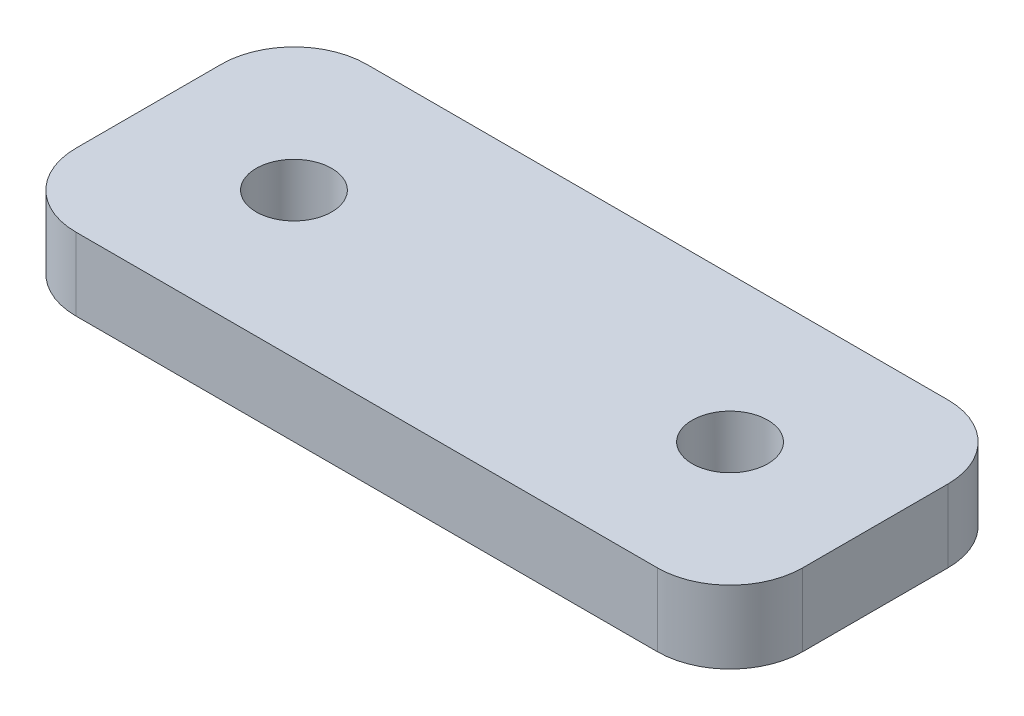
ISO-10303-21;
HEADER;
FILE_DESCRIPTION(('STEP AP214'),'2;1');
FILE_NAME('part.step','',(''),(''),'','','');
FILE_SCHEMA(('AUTOMOTIVE_DESIGN { 1 0 10303 214 1 1 1 1 }'));
ENDSEC;
DATA;
#1=APPLICATION_CONTEXT('core data for automotive mechanical design processes');
#2=APPLICATION_PROTOCOL_DEFINITION('international standard','automotive_design',2000,#1);
#3=PRODUCT_CONTEXT('',#1,'mechanical');
#4=PRODUCT('Part','Part','',(#3));
#5=PRODUCT_RELATED_PRODUCT_CATEGORY('part','',(#4));
#6=PRODUCT_DEFINITION_FORMATION('','',#4);
#7=PRODUCT_DEFINITION_CONTEXT('part definition',#1,'design');
#8=PRODUCT_DEFINITION('design','',#6,#7);
#9=PRODUCT_DEFINITION_SHAPE('','',#8);
#10=(LENGTH_UNIT() NAMED_UNIT(*) SI_UNIT(.MILLI.,.METRE.));
#11=(NAMED_UNIT(*) PLANE_ANGLE_UNIT() SI_UNIT($,.RADIAN.));
#12=(NAMED_UNIT(*) SI_UNIT($,.STERADIAN.) SOLID_ANGLE_UNIT());
#13=UNCERTAINTY_MEASURE_WITH_UNIT(LENGTH_MEASURE(1.E-05),#10,'distance_accuracy_value','');
#14=(GEOMETRIC_REPRESENTATION_CONTEXT(3) GLOBAL_UNCERTAINTY_ASSIGNED_CONTEXT((#13)) GLOBAL_UNIT_ASSIGNED_CONTEXT((#10,
#11,#12)) REPRESENTATION_CONTEXT('',''));
#15=CARTESIAN_POINT('',(0.,0.,0.));
#16=DIRECTION('',(0.,0.,1.));
#17=DIRECTION('',(1.,0.,0.));
#18=AXIS2_PLACEMENT_3D('',#15,#16,#17);
#19=CARTESIAN_POINT('',(25.,2.5,-10.));
#20=DIRECTION('',(-1.,0.,0.));
#21=DIRECTION('',(0.,0.,1.));
#22=AXIS2_PLACEMENT_3D('',#19,#20,#21);
#23=PLANE('',#22);
#24=DIRECTION('',(0.,0.,-1.));
#25=VECTOR('',#24,1.);
#26=CARTESIAN_POINT('',(25.,2.5,-10.));
#27=LINE('',#26,#25);
#28=CARTESIAN_POINT('',(25.,2.5,5.));
#29=VERTEX_POINT('',#28);
#30=CARTESIAN_POINT('',(25.,2.5,-5.));
#31=VERTEX_POINT('',#30);
#32=EDGE_CURVE('E121',#29,#31,#27,.T.);
#33=ORIENTED_EDGE('',*,*,#32,.F.);
#34=DIRECTION('',(0.,-1.,0.));
#35=VECTOR('',#34,1.);
#36=CARTESIAN_POINT('',(25.,2.5,5.));
#37=LINE('',#36,#35);
#38=CARTESIAN_POINT('',(25.,-2.5,5.));
#39=VERTEX_POINT('',#38);
#40=EDGE_CURVE('E106',#29,#39,#37,.T.);
#41=ORIENTED_EDGE('',*,*,#40,.T.);
#42=DIRECTION('',(0.,0.,-1.));
#43=VECTOR('',#42,1.);
#44=CARTESIAN_POINT('',(25.,-2.5,-10.));
#45=LINE('',#44,#43);
#46=CARTESIAN_POINT('',(25.,-2.5,-5.));
#47=VERTEX_POINT('',#46);
#48=EDGE_CURVE('E118',#39,#47,#45,.T.);
#49=ORIENTED_EDGE('',*,*,#48,.T.);
#50=DIRECTION('',(0.,-1.,0.));
#51=VECTOR('',#50,1.);
#52=CARTESIAN_POINT('',(25.,2.5,-5.));
#53=LINE('',#52,#51);
#54=EDGE_CURVE('E123',#47,#31,#53,.F.);
#55=ORIENTED_EDGE('',*,*,#54,.T.);
#56=EDGE_LOOP('',(#33,#41,#49,#55));
#57=FACE_BOUND('',#56,.T.);
#58=ADVANCED_FACE('F35',(#57),#23,.F.);
#59=CARTESIAN_POINT('',(-25.,2.5,-10.));
#60=DIRECTION('',(0.,0.,1.));
#61=DIRECTION('',(1.,0.,0.));
#62=AXIS2_PLACEMENT_3D('',#59,#60,#61);
#63=PLANE('',#62);
#64=DIRECTION('',(-1.,0.,0.));
#65=VECTOR('',#64,1.);
#66=CARTESIAN_POINT('',(-25.,2.5,-10.));
#67=LINE('',#66,#65);
#68=CARTESIAN_POINT('',(20.,2.5,-10.));
#69=VERTEX_POINT('',#68);
#70=CARTESIAN_POINT('',(-20.,2.5,-10.));
#71=VERTEX_POINT('',#70);
#72=EDGE_CURVE('E166',#69,#71,#67,.T.);
#73=ORIENTED_EDGE('',*,*,#72,.F.);
#74=DIRECTION('',(0.,-1.,0.));
#75=VECTOR('',#74,1.);
#76=CARTESIAN_POINT('',(20.,2.5,-10.));
#77=LINE('',#76,#75);
#78=CARTESIAN_POINT('',(20.,-2.5,-10.));
#79=VERTEX_POINT('',#78);
#80=EDGE_CURVE('E12',#69,#79,#77,.T.);
#81=ORIENTED_EDGE('',*,*,#80,.T.);
#82=DIRECTION('',(-1.,0.,0.));
#83=VECTOR('',#82,1.);
#84=CARTESIAN_POINT('',(-25.,-2.5,-10.));
#85=LINE('',#84,#83);
#86=CARTESIAN_POINT('',(-20.,-2.5,-10.));
#87=VERTEX_POINT('',#86);
#88=EDGE_CURVE('E128',#79,#87,#85,.T.);
#89=ORIENTED_EDGE('',*,*,#88,.T.);
#90=DIRECTION('',(0.,-1.,0.));
#91=VECTOR('',#90,1.);
#92=CARTESIAN_POINT('',(-20.,2.5,-10.));
#93=LINE('',#92,#91);
#94=EDGE_CURVE('E43',#87,#71,#93,.F.);
#95=ORIENTED_EDGE('',*,*,#94,.T.);
#96=EDGE_LOOP('',(#73,#81,#89,#95));
#97=FACE_BOUND('',#96,.T.);
#98=ADVANCED_FACE('F189',(#97),#63,.F.);
#99=CARTESIAN_POINT('',(-25.,2.5,-10.));
#100=DIRECTION('',(1.,0.,0.));
#101=DIRECTION('',(0.,0.,-1.));
#102=AXIS2_PLACEMENT_3D('',#99,#100,#101);
#103=PLANE('',#102);
#104=DIRECTION('',(0.,0.,1.));
#105=VECTOR('',#104,1.);
#106=CARTESIAN_POINT('',(-25.,-2.5,-10.));
#107=LINE('',#106,#105);
#108=CARTESIAN_POINT('',(-25.,-2.5,-5.));
#109=VERTEX_POINT('',#108);
#110=CARTESIAN_POINT('',(-25.,-2.5,5.));
#111=VERTEX_POINT('',#110);
#112=EDGE_CURVE('E132',#109,#111,#107,.T.);
#113=ORIENTED_EDGE('',*,*,#112,.T.);
#114=DIRECTION('',(0.,-1.,0.));
#115=VECTOR('',#114,1.);
#116=CARTESIAN_POINT('',(-25.,2.5,5.));
#117=LINE('',#116,#115);
#118=CARTESIAN_POINT('',(-25.,2.5,5.));
#119=VERTEX_POINT('',#118);
#120=EDGE_CURVE('E50',#111,#119,#117,.F.);
#121=ORIENTED_EDGE('',*,*,#120,.T.);
#122=DIRECTION('',(0.,0.,1.));
#123=VECTOR('',#122,1.);
#124=CARTESIAN_POINT('',(-25.,2.5,-10.));
#125=LINE('',#124,#123);
#126=CARTESIAN_POINT('',(-25.,2.5,-5.));
#127=VERTEX_POINT('',#126);
#128=EDGE_CURVE('E164',#127,#119,#125,.T.);
#129=ORIENTED_EDGE('',*,*,#128,.F.);
#130=DIRECTION('',(0.,-1.,0.));
#131=VECTOR('',#130,1.);
#132=CARTESIAN_POINT('',(-25.,2.5,-5.));
#133=LINE('',#132,#131);
#134=EDGE_CURVE('E181',#127,#109,#133,.T.);
#135=ORIENTED_EDGE('',*,*,#134,.T.);
#136=EDGE_LOOP('',(#113,#121,#129,#135));
#137=FACE_BOUND('',#136,.T.);
#138=ADVANCED_FACE('F197',(#137),#103,.F.);
#139=CARTESIAN_POINT('',(-25.,2.5,10.));
#140=DIRECTION('',(0.,0.,-1.));
#141=DIRECTION('',(-1.,0.,0.));
#142=AXIS2_PLACEMENT_3D('',#139,#140,#141);
#143=PLANE('',#142);
#144=DIRECTION('',(1.,0.,0.));
#145=VECTOR('',#144,1.);
#146=CARTESIAN_POINT('',(-25.,-2.5,10.));
#147=LINE('',#146,#145);
#148=CARTESIAN_POINT('',(-20.,-2.5,10.));
#149=VERTEX_POINT('',#148);
#150=CARTESIAN_POINT('',(20.,-2.5,10.));
#151=VERTEX_POINT('',#150);
#152=EDGE_CURVE('E143',#149,#151,#147,.T.);
#153=ORIENTED_EDGE('',*,*,#152,.T.);
#154=DIRECTION('',(0.,-1.,0.));
#155=VECTOR('',#154,1.);
#156=CARTESIAN_POINT('',(20.,2.5,10.));
#157=LINE('',#156,#155);
#158=CARTESIAN_POINT('',(20.,2.5,10.));
#159=VERTEX_POINT('',#158);
#160=EDGE_CURVE('E107',#151,#159,#157,.F.);
#161=ORIENTED_EDGE('',*,*,#160,.T.);
#162=DIRECTION('',(1.,0.,0.));
#163=VECTOR('',#162,1.);
#164=CARTESIAN_POINT('',(-25.,2.5,10.));
#165=LINE('',#164,#163);
#166=CARTESIAN_POINT('',(-20.,2.5,10.));
#167=VERTEX_POINT('',#166);
#168=EDGE_CURVE('E138',#167,#159,#165,.T.);
#169=ORIENTED_EDGE('',*,*,#168,.F.);
#170=DIRECTION('',(0.,-1.,0.));
#171=VECTOR('',#170,1.);
#172=CARTESIAN_POINT('',(-20.,2.5,10.));
#173=LINE('',#172,#171);
#174=EDGE_CURVE('E112',#167,#149,#173,.T.);
#175=ORIENTED_EDGE('',*,*,#174,.T.);
#176=EDGE_LOOP('',(#153,#161,#169,#175));
#177=FACE_BOUND('',#176,.T.);
#178=ADVANCED_FACE('F204',(#177),#143,.F.);
#179=CARTESIAN_POINT('',(0.,2.5,0.));
#180=DIRECTION('',(0.,1.,0.));
#181=DIRECTION('',(0.,0.,1.));
#182=AXIS2_PLACEMENT_3D('',#179,#180,#181);
#183=PLANE('',#182);
#184=CARTESIAN_POINT('',(15.,2.5,0.));
#185=DIRECTION('',(0.,1.,0.));
#186=DIRECTION('',(0.,0.,-1.));
#187=AXIS2_PLACEMENT_3D('',#184,#185,#186);
#188=CIRCLE('',#187,2.6);
#189=CARTESIAN_POINT('',(15.,2.5,-2.6));
#190=VERTEX_POINT('',#189);
#191=EDGE_CURVE('E148',#190,#190,#188,.T.);
#192=ORIENTED_EDGE('',*,*,#191,.F.);
#193=EDGE_LOOP('',(#192));
#194=FACE_BOUND('',#193,.T.);
#195=CARTESIAN_POINT('',(-15.,2.5,0.));
#196=DIRECTION('',(0.,1.,0.));
#197=DIRECTION('',(0.,0.,1.));
#198=AXIS2_PLACEMENT_3D('',#195,#196,#197);
#199=CIRCLE('',#198,2.6);
#200=CARTESIAN_POINT('',(-15.,2.5,2.6));
#201=VERTEX_POINT('',#200);
#202=EDGE_CURVE('E135',#201,#201,#199,.T.);
#203=ORIENTED_EDGE('',*,*,#202,.F.);
#204=EDGE_LOOP('',(#203));
#205=FACE_BOUND('',#204,.T.);
#206=ORIENTED_EDGE('',*,*,#168,.T.);
#207=CARTESIAN_POINT('',(20.,2.5,5.));
#208=DIRECTION('',(0.,1.,0.));
#209=DIRECTION('',(0.,0.,1.));
#210=AXIS2_PLACEMENT_3D('',#207,#208,#209);
#211=CIRCLE('',#210,5.);
#212=EDGE_CURVE('E178',#159,#29,#211,.T.);
#213=ORIENTED_EDGE('',*,*,#212,.T.);
#214=ORIENTED_EDGE('',*,*,#32,.T.);
#215=CARTESIAN_POINT('',(20.,2.5,-5.));
#216=DIRECTION('',(0.,1.,0.));
#217=DIRECTION('',(0.,0.,1.));
#218=AXIS2_PLACEMENT_3D('',#215,#216,#217);
#219=CIRCLE('',#218,5.);
#220=EDGE_CURVE('E158',#31,#69,#219,.T.);
#221=ORIENTED_EDGE('',*,*,#220,.T.);
#222=ORIENTED_EDGE('',*,*,#72,.T.);
#223=CARTESIAN_POINT('',(-20.,2.5,-5.));
#224=DIRECTION('',(0.,1.,0.));
#225=DIRECTION('',(0.,0.,1.));
#226=AXIS2_PLACEMENT_3D('',#223,#224,#225);
#227=CIRCLE('',#226,5.);
#228=EDGE_CURVE('E57',#71,#127,#227,.T.);
#229=ORIENTED_EDGE('',*,*,#228,.T.);
#230=ORIENTED_EDGE('',*,*,#128,.T.);
#231=CARTESIAN_POINT('',(-20.,2.5,5.));
#232=DIRECTION('',(0.,1.,0.));
#233=DIRECTION('',(0.,0.,1.));
#234=AXIS2_PLACEMENT_3D('',#231,#232,#233);
#235=CIRCLE('',#234,5.);
#236=EDGE_CURVE('E182',#119,#167,#235,.T.);
#237=ORIENTED_EDGE('',*,*,#236,.T.);
#238=EDGE_LOOP('',(#206,#213,#214,#221,#222,#229,#230,#237));
#239=FACE_BOUND('',#238,.T.);
#240=ADVANCED_FACE('F193',(#194,#205,#239),#183,.T.);
#241=CARTESIAN_POINT('',(0.,-2.5,0.));
#242=DIRECTION('',(0.,1.,0.));
#243=DIRECTION('',(0.,0.,1.));
#244=AXIS2_PLACEMENT_3D('',#241,#242,#243);
#245=PLANE('',#244);
#246=CARTESIAN_POINT('',(15.,-2.5,0.));
#247=DIRECTION('',(0.,1.,0.));
#248=DIRECTION('',(0.,0.,1.));
#249=AXIS2_PLACEMENT_3D('',#246,#247,#248);
#250=CIRCLE('',#249,2.6);
#251=CARTESIAN_POINT('',(15.,-2.5,2.6));
#252=VERTEX_POINT('',#251);
#253=EDGE_CURVE('E145',#252,#252,#250,.T.);
#254=ORIENTED_EDGE('',*,*,#253,.T.);
#255=EDGE_LOOP('',(#254));
#256=FACE_BOUND('',#255,.T.);
#257=CARTESIAN_POINT('',(-15.,-2.5,0.));
#258=DIRECTION('',(0.,1.,0.));
#259=DIRECTION('',(0.,0.,1.));
#260=AXIS2_PLACEMENT_3D('',#257,#258,#259);
#261=CIRCLE('',#260,2.6);
#262=CARTESIAN_POINT('',(-15.,-2.5,2.6));
#263=VERTEX_POINT('',#262);
#264=EDGE_CURVE('E129',#263,#263,#261,.T.);
#265=ORIENTED_EDGE('',*,*,#264,.T.);
#266=EDGE_LOOP('',(#265));
#267=FACE_BOUND('',#266,.T.);
#268=ORIENTED_EDGE('',*,*,#48,.F.);
#269=CARTESIAN_POINT('',(20.,-2.5,5.));
#270=DIRECTION('',(0.,1.,0.));
#271=DIRECTION('',(0.,0.,1.));
#272=AXIS2_PLACEMENT_3D('',#269,#270,#271);
#273=CIRCLE('',#272,5.);
#274=EDGE_CURVE('E102',#39,#151,#273,.F.);
#275=ORIENTED_EDGE('',*,*,#274,.T.);
#276=ORIENTED_EDGE('',*,*,#152,.F.);
#277=CARTESIAN_POINT('',(-20.,-2.5,5.));
#278=DIRECTION('',(0.,1.,0.));
#279=DIRECTION('',(0.,0.,1.));
#280=AXIS2_PLACEMENT_3D('',#277,#278,#279);
#281=CIRCLE('',#280,5.);
#282=EDGE_CURVE('E113',#149,#111,#281,.F.);
#283=ORIENTED_EDGE('',*,*,#282,.T.);
#284=ORIENTED_EDGE('',*,*,#112,.F.);
#285=CARTESIAN_POINT('',(-20.,-2.5,-5.));
#286=DIRECTION('',(0.,1.,0.));
#287=DIRECTION('',(0.,0.,1.));
#288=AXIS2_PLACEMENT_3D('',#285,#286,#287);
#289=CIRCLE('',#288,5.);
#290=EDGE_CURVE('E122',#109,#87,#289,.F.);
#291=ORIENTED_EDGE('',*,*,#290,.T.);
#292=ORIENTED_EDGE('',*,*,#88,.F.);
#293=CARTESIAN_POINT('',(20.,-2.5,-5.));
#294=DIRECTION('',(0.,1.,0.));
#295=DIRECTION('',(0.,0.,1.));
#296=AXIS2_PLACEMENT_3D('',#293,#294,#295);
#297=CIRCLE('',#296,5.);
#298=EDGE_CURVE('E127',#79,#47,#297,.F.);
#299=ORIENTED_EDGE('',*,*,#298,.T.);
#300=EDGE_LOOP('',(#268,#275,#276,#283,#284,#291,#292,#299));
#301=FACE_BOUND('',#300,.T.);
#302=ADVANCED_FACE('F125',(#256,#267,#301),#245,.F.);
#303=CARTESIAN_POINT('',(-15.,-3.5,0.));
#304=DIRECTION('',(0.,1.,0.));
#305=DIRECTION('',(0.,0.,1.));
#306=AXIS2_PLACEMENT_3D('',#303,#304,#305);
#307=CYLINDRICAL_SURFACE('',#306,2.6);
#308=ORIENTED_EDGE('',*,*,#202,.T.);
#309=EDGE_LOOP('',(#308));
#310=FACE_BOUND('',#309,.T.);
#311=ORIENTED_EDGE('',*,*,#264,.F.);
#312=EDGE_LOOP('',(#311));
#313=FACE_BOUND('',#312,.T.);
#314=ADVANCED_FACE('F226',(#310,#313),#307,.F.);
#315=CARTESIAN_POINT('',(15.,-3.5,0.));
#316=DIRECTION('',(0.,1.,0.));
#317=DIRECTION('',(0.,0.,1.));
#318=AXIS2_PLACEMENT_3D('',#315,#316,#317);
#319=CYLINDRICAL_SURFACE('',#318,2.6);
#320=ORIENTED_EDGE('',*,*,#191,.T.);
#321=EDGE_LOOP('',(#320));
#322=FACE_BOUND('',#321,.T.);
#323=ORIENTED_EDGE('',*,*,#253,.F.);
#324=EDGE_LOOP('',(#323));
#325=FACE_BOUND('',#324,.T.);
#326=ADVANCED_FACE('F222',(#322,#325),#319,.F.);
#327=CARTESIAN_POINT('',(20.,2.5,5.));
#328=DIRECTION('',(0.,-1.,0.));
#329=DIRECTION('',(0.,0.,-1.));
#330=AXIS2_PLACEMENT_3D('',#327,#328,#329);
#331=CYLINDRICAL_SURFACE('',#330,5.);
#332=ORIENTED_EDGE('',*,*,#212,.F.);
#333=ORIENTED_EDGE('',*,*,#160,.F.);
#334=ORIENTED_EDGE('',*,*,#274,.F.);
#335=ORIENTED_EDGE('',*,*,#40,.F.);
#336=EDGE_LOOP('',(#332,#333,#334,#335));
#337=FACE_BOUND('',#336,.T.);
#338=ADVANCED_FACE('F105',(#337),#331,.T.);
#339=CARTESIAN_POINT('',(-20.,2.5,5.));
#340=DIRECTION('',(0.,-1.,0.));
#341=DIRECTION('',(0.,0.,-1.));
#342=AXIS2_PLACEMENT_3D('',#339,#340,#341);
#343=CYLINDRICAL_SURFACE('',#342,5.);
#344=ORIENTED_EDGE('',*,*,#236,.F.);
#345=ORIENTED_EDGE('',*,*,#120,.F.);
#346=ORIENTED_EDGE('',*,*,#282,.F.);
#347=ORIENTED_EDGE('',*,*,#174,.F.);
#348=EDGE_LOOP('',(#344,#345,#346,#347));
#349=FACE_BOUND('',#348,.T.);
#350=ADVANCED_FACE('F201',(#349),#343,.T.);
#351=CARTESIAN_POINT('',(20.,2.5,-5.));
#352=DIRECTION('',(0.,-1.,0.));
#353=DIRECTION('',(0.,0.,-1.));
#354=AXIS2_PLACEMENT_3D('',#351,#352,#353);
#355=CYLINDRICAL_SURFACE('',#354,5.);
#356=ORIENTED_EDGE('',*,*,#220,.F.);
#357=ORIENTED_EDGE('',*,*,#54,.F.);
#358=ORIENTED_EDGE('',*,*,#298,.F.);
#359=ORIENTED_EDGE('',*,*,#80,.F.);
#360=EDGE_LOOP('',(#356,#357,#358,#359));
#361=FACE_BOUND('',#360,.T.);
#362=ADVANCED_FACE('F206',(#361),#355,.T.);
#363=CARTESIAN_POINT('',(-20.,2.5,-5.));
#364=DIRECTION('',(0.,-1.,0.));
#365=DIRECTION('',(0.,0.,-1.));
#366=AXIS2_PLACEMENT_3D('',#363,#364,#365);
#367=CYLINDRICAL_SURFACE('',#366,5.);
#368=ORIENTED_EDGE('',*,*,#228,.F.);
#369=ORIENTED_EDGE('',*,*,#94,.F.);
#370=ORIENTED_EDGE('',*,*,#290,.F.);
#371=ORIENTED_EDGE('',*,*,#134,.F.);
#372=EDGE_LOOP('',(#368,#369,#370,#371));
#373=FACE_BOUND('',#372,.T.);
#374=ADVANCED_FACE('F37',(#373),#367,.T.);
#375=CLOSED_SHELL('',(#58,#98,#138,#178,#240,#302,#314,#326,#338,#350,#362,#374));
#376=MANIFOLD_SOLID_BREP('B2',#375);
#377=ADVANCED_BREP_SHAPE_REPRESENTATION('',(#18,#376),#14);
#378=SHAPE_DEFINITION_REPRESENTATION(#9,#377);
ENDSEC;
END-ISO-10303-21;
